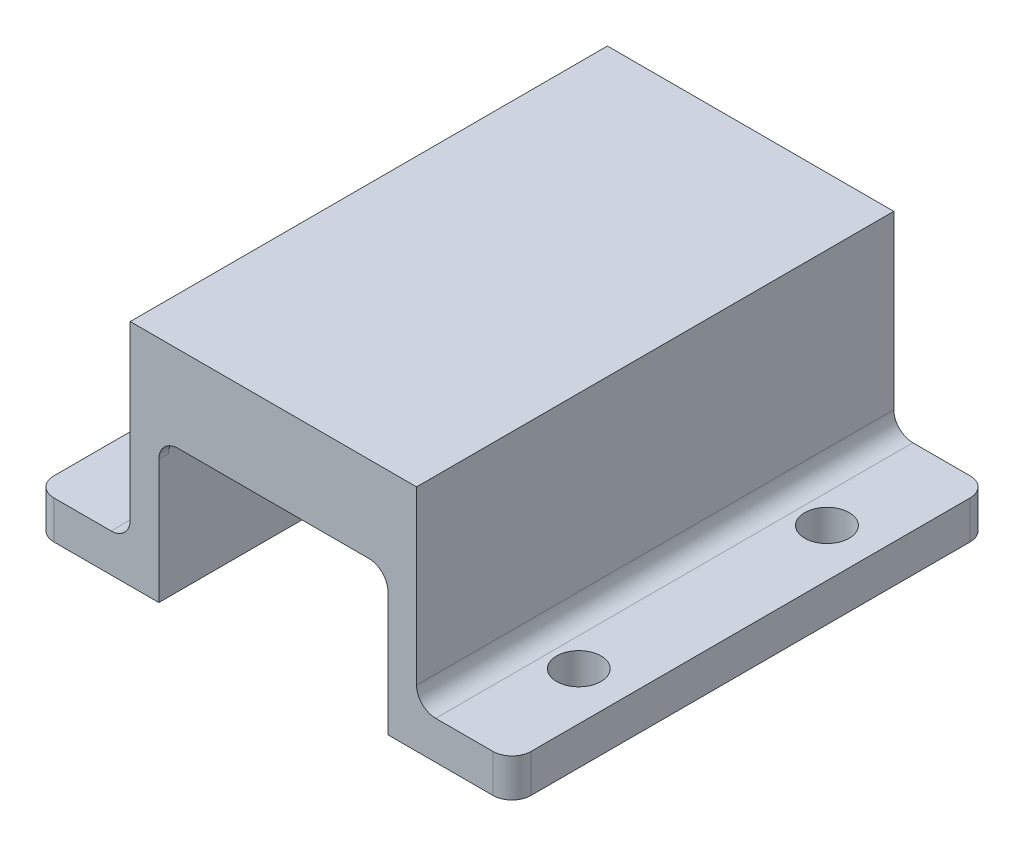
ISO-10303-21;
HEADER;
FILE_DESCRIPTION(('STEP AP214'),'2;1');
FILE_NAME('part.step','',(''),(''),'','','');
FILE_SCHEMA(('AUTOMOTIVE_DESIGN { 1 0 10303 214 1 1 1 1 }'));
ENDSEC;
DATA;
#1=APPLICATION_CONTEXT('core data for automotive mechanical design processes');
#2=APPLICATION_PROTOCOL_DEFINITION('international standard','automotive_design',2000,#1);
#3=PRODUCT_CONTEXT('',#1,'mechanical');
#4=PRODUCT('Part','Part','',(#3));
#5=PRODUCT_RELATED_PRODUCT_CATEGORY('part','',(#4));
#6=PRODUCT_DEFINITION_FORMATION('','',#4);
#7=PRODUCT_DEFINITION_CONTEXT('part definition',#1,'design');
#8=PRODUCT_DEFINITION('design','',#6,#7);
#9=PRODUCT_DEFINITION_SHAPE('','',#8);
#10=(LENGTH_UNIT() NAMED_UNIT(*) SI_UNIT(.MILLI.,.METRE.));
#11=(NAMED_UNIT(*) PLANE_ANGLE_UNIT() SI_UNIT($,.RADIAN.));
#12=(NAMED_UNIT(*) SI_UNIT($,.STERADIAN.) SOLID_ANGLE_UNIT());
#13=UNCERTAINTY_MEASURE_WITH_UNIT(LENGTH_MEASURE(1.E-05),#10,'distance_accuracy_value','');
#14=(GEOMETRIC_REPRESENTATION_CONTEXT(3) GLOBAL_UNCERTAINTY_ASSIGNED_CONTEXT((#13)) GLOBAL_UNIT_ASSIGNED_CONTEXT((#10,
#11,#12)) REPRESENTATION_CONTEXT('',''));
#15=CARTESIAN_POINT('',(0.,0.,0.));
#16=DIRECTION('',(0.,0.,1.));
#17=DIRECTION('',(1.,0.,0.));
#18=AXIS2_PLACEMENT_3D('',#15,#16,#17);
#19=CARTESIAN_POINT('',(1.5,0.,0.));
#20=DIRECTION('',(1.,0.,0.));
#21=DIRECTION('',(0.,0.,-1.));
#22=AXIS2_PLACEMENT_3D('',#19,#20,#21);
#23=PLANE('',#22);
#24=DIRECTION('',(0.,1.,0.));
#25=VECTOR('',#24,1.);
#26=CARTESIAN_POINT('',(1.5,7.5,29.5));
#27=LINE('',#26,#25);
#28=CARTESIAN_POINT('',(1.5,6.5,29.5));
#29=VERTEX_POINT('',#28);
#30=CARTESIAN_POINT('',(1.5,9.,29.5));
#31=VERTEX_POINT('',#30);
#32=EDGE_CURVE('E455',#29,#31,#27,.T.);
#33=ORIENTED_EDGE('',*,*,#32,.F.);
#34=DIRECTION('',(0.,0.,-1.));
#35=VECTOR('',#34,1.);
#36=CARTESIAN_POINT('',(1.5,6.5,0.));
#37=LINE('',#36,#35);
#38=CARTESIAN_POINT('',(1.5,6.5,30.));
#39=VERTEX_POINT('',#38);
#40=EDGE_CURVE('E294',#29,#39,#37,.F.);
#41=ORIENTED_EDGE('',*,*,#40,.T.);
#42=DIRECTION('',(0.,1.,0.));
#43=VECTOR('',#42,1.);
#44=CARTESIAN_POINT('',(1.5,0.,30.));
#45=LINE('',#44,#43);
#46=CARTESIAN_POINT('',(1.5,0.,30.));
#47=VERTEX_POINT('',#46);
#48=EDGE_CURVE('E447',#47,#39,#45,.T.);
#49=ORIENTED_EDGE('',*,*,#48,.F.);
#50=DIRECTION('',(0.,0.,1.));
#51=VECTOR('',#50,1.);
#52=CARTESIAN_POINT('',(1.5,0.,0.));
#53=LINE('',#52,#51);
#54=CARTESIAN_POINT('',(1.5,0.,4.99999999999999));
#55=VERTEX_POINT('',#54);
#56=EDGE_CURVE('E439',#55,#47,#53,.T.);
#57=ORIENTED_EDGE('',*,*,#56,.F.);
#58=DIRECTION('',(0.,-1.,0.));
#59=VECTOR('',#58,1.);
#60=CARTESIAN_POINT('',(1.5,0.,4.99999999999999));
#61=LINE('',#60,#59);
#62=CARTESIAN_POINT('',(1.5,6.5,4.99999999999999));
#63=VERTEX_POINT('',#62);
#64=EDGE_CURVE('E504',#63,#55,#61,.T.);
#65=ORIENTED_EDGE('',*,*,#64,.F.);
#66=DIRECTION('',(0.,0.,-1.));
#67=VECTOR('',#66,1.);
#68=CARTESIAN_POINT('',(1.5,6.5,0.));
#69=LINE('',#68,#67);
#70=CARTESIAN_POINT('',(1.5,6.5,5.5));
#71=VERTEX_POINT('',#70);
#72=EDGE_CURVE('E290',#63,#71,#69,.F.);
#73=ORIENTED_EDGE('',*,*,#72,.T.);
#74=DIRECTION('',(0.,1.,0.));
#75=VECTOR('',#74,1.);
#76=CARTESIAN_POINT('',(1.5,7.5,5.5));
#77=LINE('',#76,#75);
#78=CARTESIAN_POINT('',(1.5,9.,5.5));
#79=VERTEX_POINT('',#78);
#80=EDGE_CURVE('E482',#71,#79,#77,.T.);
#81=ORIENTED_EDGE('',*,*,#80,.T.);
#82=DIRECTION('',(0.,0.,1.));
#83=VECTOR('',#82,1.);
#84=CARTESIAN_POINT('',(1.5,9.,30.));
#85=LINE('',#84,#83);
#86=EDGE_CURVE('E271',#79,#31,#85,.T.);
#87=ORIENTED_EDGE('',*,*,#86,.T.);
#88=EDGE_LOOP('',(#33,#41,#49,#57,#65,#73,#81,#87));
#89=FACE_BOUND('',#88,.T.);
#90=ADVANCED_FACE('F39',(#89),#23,.T.);
#91=CARTESIAN_POINT('',(1.5,10.,0.));
#92=DIRECTION('',(0.,-1.,0.));
#93=DIRECTION('',(0.,0.,-1.));
#94=AXIS2_PLACEMENT_3D('',#91,#92,#93);
#95=PLANE('',#94);
#96=DIRECTION('',(0.,0.,1.));
#97=VECTOR('',#96,1.);
#98=CARTESIAN_POINT('',(2.5,10.,0.));
#99=LINE('',#98,#97);
#100=CARTESIAN_POINT('',(2.5,10.,29.5));
#101=VERTEX_POINT('',#100);
#102=CARTESIAN_POINT('',(2.5,10.,5.5));
#103=VERTEX_POINT('',#102);
#104=EDGE_CURVE('E254',#101,#103,#99,.F.);
#105=ORIENTED_EDGE('',*,*,#104,.T.);
#106=DIRECTION('',(-1.,0.,0.));
#107=VECTOR('',#106,1.);
#108=CARTESIAN_POINT('',(13.5,10.,5.5));
#109=LINE('',#108,#107);
#110=CARTESIAN_POINT('',(12.5,10.,5.5));
#111=VERTEX_POINT('',#110);
#112=EDGE_CURVE('E486',#111,#103,#109,.T.);
#113=ORIENTED_EDGE('',*,*,#112,.F.);
#114=DIRECTION('',(0.,0.,1.));
#115=VECTOR('',#114,1.);
#116=CARTESIAN_POINT('',(12.5,10.,0.));
#117=LINE('',#116,#115);
#118=CARTESIAN_POINT('',(12.5,10.,29.5));
#119=VERTEX_POINT('',#118);
#120=EDGE_CURVE('E260',#111,#119,#117,.T.);
#121=ORIENTED_EDGE('',*,*,#120,.T.);
#122=DIRECTION('',(1.,0.,0.));
#123=VECTOR('',#122,1.);
#124=CARTESIAN_POINT('',(13.5,10.,29.5));
#125=LINE('',#124,#123);
#126=EDGE_CURVE('E463',#101,#119,#125,.T.);
#127=ORIENTED_EDGE('',*,*,#126,.F.);
#128=EDGE_LOOP('',(#105,#113,#121,#127));
#129=FACE_BOUND('',#128,.T.);
#130=ADVANCED_FACE('F598',(#129),#95,.T.);
#131=CARTESIAN_POINT('',(13.5,0.,0.));
#132=DIRECTION('',(1.,0.,0.));
#133=DIRECTION('',(0.,0.,-1.));
#134=AXIS2_PLACEMENT_3D('',#131,#132,#133);
#135=PLANE('',#134);
#136=DIRECTION('',(0.,1.,0.));
#137=VECTOR('',#136,1.);
#138=CARTESIAN_POINT('',(13.5,0.,30.));
#139=LINE('',#138,#137);
#140=CARTESIAN_POINT('',(13.5,0.,30.));
#141=VERTEX_POINT('',#140);
#142=CARTESIAN_POINT('',(13.5,6.5,30.));
#143=VERTEX_POINT('',#142);
#144=EDGE_CURVE('E443',#141,#143,#139,.T.);
#145=ORIENTED_EDGE('',*,*,#144,.T.);
#146=DIRECTION('',(0.,0.,1.));
#147=VECTOR('',#146,1.);
#148=CARTESIAN_POINT('',(13.5,6.5,29.5));
#149=LINE('',#148,#147);
#150=CARTESIAN_POINT('',(13.5,6.5,29.5));
#151=VERTEX_POINT('',#150);
#152=EDGE_CURVE('E300',#143,#151,#149,.F.);
#153=ORIENTED_EDGE('',*,*,#152,.T.);
#154=DIRECTION('',(0.,1.,0.));
#155=VECTOR('',#154,1.);
#156=CARTESIAN_POINT('',(13.5,7.5,29.5));
#157=LINE('',#156,#155);
#158=CARTESIAN_POINT('',(13.5,9.,29.5));
#159=VERTEX_POINT('',#158);
#160=EDGE_CURVE('E459',#151,#159,#157,.T.);
#161=ORIENTED_EDGE('',*,*,#160,.T.);
#162=DIRECTION('',(0.,0.,1.));
#163=VECTOR('',#162,1.);
#164=CARTESIAN_POINT('',(13.5,9.,0.));
#165=LINE('',#164,#163);
#166=CARTESIAN_POINT('',(13.5,9.,5.5));
#167=VERTEX_POINT('',#166);
#168=EDGE_CURVE('E267',#159,#167,#165,.F.);
#169=ORIENTED_EDGE('',*,*,#168,.T.);
#170=DIRECTION('',(0.,1.,0.));
#171=VECTOR('',#170,1.);
#172=CARTESIAN_POINT('',(13.5,7.5,5.5));
#173=LINE('',#172,#171);
#174=CARTESIAN_POINT('',(13.5,6.5,5.5));
#175=VERTEX_POINT('',#174);
#176=EDGE_CURVE('E478',#175,#167,#173,.T.);
#177=ORIENTED_EDGE('',*,*,#176,.F.);
#178=DIRECTION('',(0.,0.,1.));
#179=VECTOR('',#178,1.);
#180=CARTESIAN_POINT('',(13.5,6.5,5.));
#181=LINE('',#180,#179);
#182=CARTESIAN_POINT('',(13.5,6.5,5.));
#183=VERTEX_POINT('',#182);
#184=EDGE_CURVE('E297',#175,#183,#181,.F.);
#185=ORIENTED_EDGE('',*,*,#184,.T.);
#186=DIRECTION('',(0.,-1.,0.));
#187=VECTOR('',#186,1.);
#188=CARTESIAN_POINT('',(13.5,0.,5.));
#189=LINE('',#188,#187);
#190=CARTESIAN_POINT('',(13.5,0.,5.));
#191=VERTEX_POINT('',#190);
#192=EDGE_CURVE('E508',#183,#191,#189,.T.);
#193=ORIENTED_EDGE('',*,*,#192,.T.);
#194=DIRECTION('',(0.,0.,1.));
#195=VECTOR('',#194,1.);
#196=CARTESIAN_POINT('',(13.5,0.,0.));
#197=LINE('',#196,#195);
#198=EDGE_CURVE('E436',#191,#141,#197,.T.);
#199=ORIENTED_EDGE('',*,*,#198,.T.);
#200=EDGE_LOOP('',(#145,#153,#161,#169,#177,#185,#193,#199));
#201=FACE_BOUND('',#200,.T.);
#202=ADVANCED_FACE('F606',(#201),#135,.F.);
#203=CARTESIAN_POINT('',(12.5,9.,0.));
#204=DIRECTION('',(0.,0.,1.));
#205=DIRECTION('',(1.,0.,0.));
#206=AXIS2_PLACEMENT_3D('',#203,#204,#205);
#207=CYLINDRICAL_SURFACE('',#206,1.);
#208=CARTESIAN_POINT('',(12.5,9.,5.5));
#209=DIRECTION('',(0.,0.,-1.));
#210=DIRECTION('',(-1.,0.,0.));
#211=AXIS2_PLACEMENT_3D('',#208,#209,#210);
#212=CIRCLE('',#211,1.);
#213=EDGE_CURVE('E468',#167,#111,#212,.F.);
#214=ORIENTED_EDGE('',*,*,#213,.F.);
#215=ORIENTED_EDGE('',*,*,#168,.F.);
#216=CARTESIAN_POINT('',(12.5,9.,29.5));
#217=DIRECTION('',(0.,0.,1.));
#218=DIRECTION('',(1.,0.,0.));
#219=AXIS2_PLACEMENT_3D('',#216,#217,#218);
#220=CIRCLE('',#219,1.);
#221=EDGE_CURVE('E451',#119,#159,#220,.F.);
#222=ORIENTED_EDGE('',*,*,#221,.F.);
#223=ORIENTED_EDGE('',*,*,#120,.F.);
#224=EDGE_LOOP('',(#214,#215,#222,#223));
#225=FACE_BOUND('',#224,.T.);
#226=ADVANCED_FACE('F624',(#225),#207,.F.);
#227=CARTESIAN_POINT('',(2.5,9.,0.));
#228=DIRECTION('',(0.,0.,-1.));
#229=DIRECTION('',(-1.,0.,0.));
#230=AXIS2_PLACEMENT_3D('',#227,#228,#229);
#231=CYLINDRICAL_SURFACE('',#230,1.);
#232=CARTESIAN_POINT('',(2.5,9.,5.5));
#233=DIRECTION('',(0.,0.,-1.));
#234=DIRECTION('',(-1.,0.,0.));
#235=AXIS2_PLACEMENT_3D('',#232,#233,#234);
#236=CIRCLE('',#235,1.);
#237=EDGE_CURVE('E278',#103,#79,#236,.F.);
#238=ORIENTED_EDGE('',*,*,#237,.F.);
#239=ORIENTED_EDGE('',*,*,#104,.F.);
#240=CARTESIAN_POINT('',(2.5,9.,29.5));
#241=DIRECTION('',(0.,0.,1.));
#242=DIRECTION('',(1.,0.,0.));
#243=AXIS2_PLACEMENT_3D('',#240,#241,#242);
#244=CIRCLE('',#243,1.);
#245=EDGE_CURVE('E274',#31,#101,#244,.F.);
#246=ORIENTED_EDGE('',*,*,#245,.F.);
#247=ORIENTED_EDGE('',*,*,#86,.F.);
#248=EDGE_LOOP('',(#238,#239,#246,#247));
#249=FACE_BOUND('',#248,.T.);
#250=ADVANCED_FACE('F582',(#249),#231,.F.);
#251=CARTESIAN_POINT('',(0.,0.,30.));
#252=DIRECTION('',(0.,1.,0.));
#253=DIRECTION('',(0.,0.,1.));
#254=AXIS2_PLACEMENT_3D('',#251,#252,#253);
#255=PLANE('',#254);
#256=DIRECTION('',(1.,0.,0.));
#257=VECTOR('',#256,1.);
#258=CARTESIAN_POINT('',(0.,0.,30.));
#259=LINE('',#258,#257);
#260=CARTESIAN_POINT('',(-4.,0.,30.));
#261=VERTEX_POINT('',#260);
#262=EDGE_CURVE('E425',#261,#47,#259,.T.);
#263=ORIENTED_EDGE('',*,*,#262,.F.);
#264=CARTESIAN_POINT('',(-4.,0.,29.));
#265=DIRECTION('',(0.,1.,0.));
#266=DIRECTION('',(0.,0.,1.));
#267=AXIS2_PLACEMENT_3D('',#264,#265,#266);
#268=CIRCLE('',#267,1.);
#269=CARTESIAN_POINT('',(-5.,0.,29.));
#270=VERTEX_POINT('',#269);
#271=EDGE_CURVE('E322',#261,#270,#268,.F.);
#272=ORIENTED_EDGE('',*,*,#271,.T.);
#273=DIRECTION('',(0.,0.,-1.));
#274=VECTOR('',#273,1.);
#275=CARTESIAN_POINT('',(-5.,0.,5.));
#276=LINE('',#275,#274);
#277=CARTESIAN_POINT('',(-5.,0.,5.99999999999999));
#278=VERTEX_POINT('',#277);
#279=EDGE_CURVE('E537',#270,#278,#276,.T.);
#280=ORIENTED_EDGE('',*,*,#279,.T.);
#281=CARTESIAN_POINT('',(-4.,0.,5.99999999999999));
#282=DIRECTION('',(0.,1.,0.));
#283=DIRECTION('',(0.,0.,1.));
#284=AXIS2_PLACEMENT_3D('',#281,#282,#283);
#285=CIRCLE('',#284,1.);
#286=CARTESIAN_POINT('',(-4.,0.,4.99999999999999));
#287=VERTEX_POINT('',#286);
#288=EDGE_CURVE('E319',#278,#287,#285,.F.);
#289=ORIENTED_EDGE('',*,*,#288,.T.);
#290=DIRECTION('',(1.,0.,0.));
#291=VECTOR('',#290,1.);
#292=CARTESIAN_POINT('',(0.,0.,4.99999999999999));
#293=LINE('',#292,#291);
#294=EDGE_CURVE('E491',#287,#55,#293,.T.);
#295=ORIENTED_EDGE('',*,*,#294,.T.);
#296=ORIENTED_EDGE('',*,*,#56,.T.);
#297=EDGE_LOOP('',(#263,#272,#280,#289,#295,#296));
#298=FACE_BOUND('',#297,.T.);
#299=CARTESIAN_POINT('',(-2.5,0.,24.));
#300=DIRECTION('',(0.,-1.,0.));
#301=DIRECTION('',(0.,0.,1.));
#302=AXIS2_PLACEMENT_3D('',#299,#300,#301);
#303=CIRCLE('',#302,1.16297504238046);
#304=CARTESIAN_POINT('',(-2.5,0.,25.1629750423805));
#305=VERTEX_POINT('',#304);
#306=EDGE_CURVE('E560',#305,#305,#303,.T.);
#307=ORIENTED_EDGE('',*,*,#306,.F.);
#308=EDGE_LOOP('',(#307));
#309=FACE_BOUND('',#308,.T.);
#310=CARTESIAN_POINT('',(-2.5,0.,11.));
#311=DIRECTION('',(0.,-1.,0.));
#312=DIRECTION('',(0.,0.,1.));
#313=AXIS2_PLACEMENT_3D('',#310,#311,#312);
#314=CIRCLE('',#313,1.16485131417154);
#315=CARTESIAN_POINT('',(-2.5,0.,12.1648513141715));
#316=VERTEX_POINT('',#315);
#317=EDGE_CURVE('E552',#316,#316,#314,.T.);
#318=ORIENTED_EDGE('',*,*,#317,.F.);
#319=EDGE_LOOP('',(#318));
#320=FACE_BOUND('',#319,.T.);
#321=ADVANCED_FACE('F579',(#298,#309,#320),#255,.F.);
#322=CARTESIAN_POINT('',(0.,0.,30.));
#323=DIRECTION('',(0.,0.,-1.));
#324=DIRECTION('',(-1.,0.,0.));
#325=AXIS2_PLACEMENT_3D('',#322,#323,#324);
#326=PLANE('',#325);
#327=DIRECTION('',(-1.,0.,0.));
#328=VECTOR('',#327,1.);
#329=CARTESIAN_POINT('',(0.,2.,30.));
#330=LINE('',#329,#328);
#331=CARTESIAN_POINT('',(-1.,2.,30.));
#332=VERTEX_POINT('',#331);
#333=CARTESIAN_POINT('',(-4.,2.,30.));
#334=VERTEX_POINT('',#333);
#335=EDGE_CURVE('E541',#332,#334,#330,.T.);
#336=ORIENTED_EDGE('',*,*,#335,.T.);
#337=DIRECTION('',(0.,-1.,0.));
#338=VECTOR('',#337,1.);
#339=CARTESIAN_POINT('',(-4.,0.,30.));
#340=LINE('',#339,#338);
#341=EDGE_CURVE('E315',#334,#261,#340,.T.);
#342=ORIENTED_EDGE('',*,*,#341,.T.);
#343=ORIENTED_EDGE('',*,*,#262,.T.);
#344=ORIENTED_EDGE('',*,*,#48,.T.);
#345=CARTESIAN_POINT('',(2.5,6.5,30.));
#346=DIRECTION('',(0.,0.,-1.));
#347=DIRECTION('',(-1.,0.,0.));
#348=AXIS2_PLACEMENT_3D('',#345,#346,#347);
#349=CIRCLE('',#348,1.);
#350=CARTESIAN_POINT('',(2.5,7.5,30.));
#351=VERTEX_POINT('',#350);
#352=EDGE_CURVE('E378',#39,#351,#349,.T.);
#353=ORIENTED_EDGE('',*,*,#352,.T.);
#354=DIRECTION('',(-1.,0.,0.));
#355=VECTOR('',#354,1.);
#356=CARTESIAN_POINT('',(13.5,7.5,30.));
#357=LINE('',#356,#355);
#358=CARTESIAN_POINT('',(12.5,7.5,30.));
#359=VERTEX_POINT('',#358);
#360=EDGE_CURVE('E467',#359,#351,#357,.T.);
#361=ORIENTED_EDGE('',*,*,#360,.F.);
#362=CARTESIAN_POINT('',(12.5,6.5,30.));
#363=DIRECTION('',(0.,0.,-1.));
#364=DIRECTION('',(-1.,0.,0.));
#365=AXIS2_PLACEMENT_3D('',#362,#363,#364);
#366=CIRCLE('',#365,1.);
#367=EDGE_CURVE('E381',#359,#143,#366,.T.);
#368=ORIENTED_EDGE('',*,*,#367,.T.);
#369=ORIENTED_EDGE('',*,*,#144,.F.);
#370=CARTESIAN_POINT('',(19.,0.,30.));
#371=VERTEX_POINT('',#370);
#372=EDGE_CURVE('E429',#141,#371,#259,.T.);
#373=ORIENTED_EDGE('',*,*,#372,.T.);
#374=DIRECTION('',(0.,-1.,0.));
#375=VECTOR('',#374,1.);
#376=CARTESIAN_POINT('',(19.,2.,30.));
#377=LINE('',#376,#375);
#378=CARTESIAN_POINT('',(19.,2.,30.));
#379=VERTEX_POINT('',#378);
#380=EDGE_CURVE('E312',#371,#379,#377,.F.);
#381=ORIENTED_EDGE('',*,*,#380,.T.);
#382=DIRECTION('',(-1.,0.,0.));
#383=VECTOR('',#382,1.);
#384=CARTESIAN_POINT('',(15.,2.,30.));
#385=LINE('',#384,#383);
#386=CARTESIAN_POINT('',(16.,2.,30.));
#387=VERTEX_POINT('',#386);
#388=EDGE_CURVE('E238',#379,#387,#385,.T.);
#389=ORIENTED_EDGE('',*,*,#388,.T.);
#390=CARTESIAN_POINT('',(16.,3.,30.));
#391=DIRECTION('',(0.,0.,-1.));
#392=DIRECTION('',(-1.,0.,0.));
#393=AXIS2_PLACEMENT_3D('',#390,#391,#392);
#394=CIRCLE('',#393,1.);
#395=CARTESIAN_POINT('',(15.,3.,30.));
#396=VERTEX_POINT('',#395);
#397=EDGE_CURVE('E11',#387,#396,#394,.T.);
#398=ORIENTED_EDGE('',*,*,#397,.T.);
#399=DIRECTION('',(0.,1.,0.));
#400=VECTOR('',#399,1.);
#401=CARTESIAN_POINT('',(15.,0.,30.));
#402=LINE('',#401,#400);
#403=CARTESIAN_POINT('',(15.,12.,30.));
#404=VERTEX_POINT('',#403);
#405=EDGE_CURVE('E423',#396,#404,#402,.T.);
#406=ORIENTED_EDGE('',*,*,#405,.T.);
#407=DIRECTION('',(-1.,0.,0.));
#408=VECTOR('',#407,1.);
#409=CARTESIAN_POINT('',(0.,12.,30.));
#410=LINE('',#409,#408);
#411=CARTESIAN_POINT('',(0.,12.,30.));
#412=VERTEX_POINT('',#411);
#413=EDGE_CURVE('E252',#404,#412,#410,.T.);
#414=ORIENTED_EDGE('',*,*,#413,.T.);
#415=DIRECTION('',(0.,-1.,0.));
#416=VECTOR('',#415,1.);
#417=CARTESIAN_POINT('',(0.,0.,30.));
#418=LINE('',#417,#416);
#419=CARTESIAN_POINT('',(0.,3.,30.));
#420=VERTEX_POINT('',#419);
#421=EDGE_CURVE('E432',#412,#420,#418,.T.);
#422=ORIENTED_EDGE('',*,*,#421,.T.);
#423=CARTESIAN_POINT('',(-1.,3.,30.));
#424=DIRECTION('',(0.,0.,-1.));
#425=DIRECTION('',(-1.,0.,0.));
#426=AXIS2_PLACEMENT_3D('',#423,#424,#425);
#427=CIRCLE('',#426,1.);
#428=EDGE_CURVE('E400',#420,#332,#427,.T.);
#429=ORIENTED_EDGE('',*,*,#428,.T.);
#430=EDGE_LOOP('',(#336,#342,#343,#344,#353,#361,#368,#369,#373,#381,#389,#398,#406,#414,#422,#429));
#431=FACE_BOUND('',#430,.T.);
#432=ADVANCED_FACE('F422',(#431),#326,.F.);
#433=CARTESIAN_POINT('',(0.,0.,30.));
#434=DIRECTION('',(1.,0.,0.));
#435=DIRECTION('',(0.,0.,-1.));
#436=AXIS2_PLACEMENT_3D('',#433,#434,#435);
#437=PLANE('',#436);
#438=DIRECTION('',(0.,-1.,0.));
#439=VECTOR('',#438,1.);
#440=CARTESIAN_POINT('',(0.,12.,4.99999999999999));
#441=LINE('',#440,#439);
#442=CARTESIAN_POINT('',(0.,12.,5.));
#443=VERTEX_POINT('',#442);
#444=CARTESIAN_POINT('',(0.,3.,4.99999999999999));
#445=VERTEX_POINT('',#444);
#446=EDGE_CURVE('E232',#443,#445,#441,.T.);
#447=ORIENTED_EDGE('',*,*,#446,.T.);
#448=DIRECTION('',(0.,0.,1.));
#449=VECTOR('',#448,1.);
#450=CARTESIAN_POINT('',(0.,3.,30.));
#451=LINE('',#450,#449);
#452=EDGE_CURVE('E348',#445,#420,#451,.T.);
#453=ORIENTED_EDGE('',*,*,#452,.T.);
#454=ORIENTED_EDGE('',*,*,#421,.F.);
#455=DIRECTION('',(0.,0.,-1.));
#456=VECTOR('',#455,1.);
#457=CARTESIAN_POINT('',(0.,12.,30.));
#458=LINE('',#457,#456);
#459=EDGE_CURVE('E255',#412,#443,#458,.T.);
#460=ORIENTED_EDGE('',*,*,#459,.T.);
#461=EDGE_LOOP('',(#447,#453,#454,#460));
#462=FACE_BOUND('',#461,.T.);
#463=ADVANCED_FACE('F613',(#462),#437,.F.);
#464=DIRECTION('',(1.,0.,0.));
#465=VECTOR('',#464,1.);
#466=CARTESIAN_POINT('',(0.,0.,4.99999999999999));
#467=LINE('',#466,#465);
#468=CARTESIAN_POINT('',(19.,0.,5.));
#469=VERTEX_POINT('',#468);
#470=EDGE_CURVE('E500',#191,#469,#467,.T.);
#471=ORIENTED_EDGE('',*,*,#470,.T.);
#472=CARTESIAN_POINT('',(19.,0.,6.));
#473=DIRECTION('',(0.,1.,0.));
#474=DIRECTION('',(0.,0.,1.));
#475=AXIS2_PLACEMENT_3D('',#472,#473,#474);
#476=CIRCLE('',#475,1.);
#477=CARTESIAN_POINT('',(20.,0.,6.));
#478=VERTEX_POINT('',#477);
#479=EDGE_CURVE('E355',#469,#478,#476,.F.);
#480=ORIENTED_EDGE('',*,*,#479,.T.);
#481=DIRECTION('',(0.,0.,1.));
#482=VECTOR('',#481,1.);
#483=CARTESIAN_POINT('',(20.,0.,5.));
#484=LINE('',#483,#482);
#485=CARTESIAN_POINT('',(20.,0.,29.));
#486=VERTEX_POINT('',#485);
#487=EDGE_CURVE('E417',#478,#486,#484,.T.);
#488=ORIENTED_EDGE('',*,*,#487,.T.);
#489=CARTESIAN_POINT('',(19.,0.,29.));
#490=DIRECTION('',(0.,1.,0.));
#491=DIRECTION('',(0.,0.,1.));
#492=AXIS2_PLACEMENT_3D('',#489,#490,#491);
#493=CIRCLE('',#492,1.);
#494=EDGE_CURVE('E352',#486,#371,#493,.F.);
#495=ORIENTED_EDGE('',*,*,#494,.T.);
#496=ORIENTED_EDGE('',*,*,#372,.F.);
#497=ORIENTED_EDGE('',*,*,#198,.F.);
#498=EDGE_LOOP('',(#471,#480,#488,#495,#496,#497));
#499=FACE_BOUND('',#498,.T.);
#500=CARTESIAN_POINT('',(17.5,0.,11.));
#501=DIRECTION('',(0.,-1.,0.));
#502=DIRECTION('',(0.,0.,-1.));
#503=AXIS2_PLACEMENT_3D('',#500,#501,#502);
#504=CIRCLE('',#503,1.16485131417154);
#505=CARTESIAN_POINT('',(17.5,0.,9.83514868582846));
#506=VERTEX_POINT('',#505);
#507=EDGE_CURVE('E529',#506,#506,#504,.T.);
#508=ORIENTED_EDGE('',*,*,#507,.F.);
#509=EDGE_LOOP('',(#508));
#510=FACE_BOUND('',#509,.T.);
#511=CARTESIAN_POINT('',(17.5,0.,24.));
#512=DIRECTION('',(0.,-1.,0.));
#513=DIRECTION('',(0.,0.,-1.));
#514=AXIS2_PLACEMENT_3D('',#511,#512,#513);
#515=CIRCLE('',#514,1.16297504238046);
#516=CARTESIAN_POINT('',(17.5,0.,22.8370249576195));
#517=VERTEX_POINT('',#516);
#518=EDGE_CURVE('E521',#517,#517,#515,.T.);
#519=ORIENTED_EDGE('',*,*,#518,.F.);
#520=EDGE_LOOP('',(#519));
#521=FACE_BOUND('',#520,.T.);
#522=ADVANCED_FACE('F585',(#499,#510,#521),#255,.F.);
#523=CARTESIAN_POINT('',(15.,0.,30.));
#524=DIRECTION('',(-1.,0.,0.));
#525=DIRECTION('',(0.,0.,1.));
#526=AXIS2_PLACEMENT_3D('',#523,#524,#525);
#527=PLANE('',#526);
#528=ORIENTED_EDGE('',*,*,#405,.F.);
#529=DIRECTION('',(0.,0.,-1.));
#530=VECTOR('',#529,1.);
#531=CARTESIAN_POINT('',(15.,3.,30.));
#532=LINE('',#531,#530);
#533=CARTESIAN_POINT('',(15.,3.,5.));
#534=VERTEX_POINT('',#533);
#535=EDGE_CURVE('E248',#396,#534,#532,.T.);
#536=ORIENTED_EDGE('',*,*,#535,.T.);
#537=DIRECTION('',(0.,-1.,0.));
#538=VECTOR('',#537,1.);
#539=CARTESIAN_POINT('',(15.,12.,5.));
#540=LINE('',#539,#538);
#541=CARTESIAN_POINT('',(15.,12.,5.));
#542=VERTEX_POINT('',#541);
#543=EDGE_CURVE('E230',#542,#534,#540,.T.);
#544=ORIENTED_EDGE('',*,*,#543,.F.);
#545=DIRECTION('',(0.,0.,-1.));
#546=VECTOR('',#545,1.);
#547=CARTESIAN_POINT('',(15.,12.,30.));
#548=LINE('',#547,#546);
#549=EDGE_CURVE('E245',#404,#542,#548,.T.);
#550=ORIENTED_EDGE('',*,*,#549,.F.);
#551=EDGE_LOOP('',(#528,#536,#544,#550));
#552=FACE_BOUND('',#551,.T.);
#553=ADVANCED_FACE('F244',(#552),#527,.F.);
#554=CARTESIAN_POINT('',(0.,12.,30.));
#555=DIRECTION('',(0.,-1.,0.));
#556=DIRECTION('',(0.,0.,-1.));
#557=AXIS2_PLACEMENT_3D('',#554,#555,#556);
#558=PLANE('',#557);
#559=ORIENTED_EDGE('',*,*,#549,.T.);
#560=DIRECTION('',(-1.,0.,0.));
#561=VECTOR('',#560,1.);
#562=CARTESIAN_POINT('',(15.,12.,5.));
#563=LINE('',#562,#561);
#564=EDGE_CURVE('E226',#542,#443,#563,.T.);
#565=ORIENTED_EDGE('',*,*,#564,.T.);
#566=ORIENTED_EDGE('',*,*,#459,.F.);
#567=ORIENTED_EDGE('',*,*,#413,.F.);
#568=EDGE_LOOP('',(#559,#565,#566,#567));
#569=FACE_BOUND('',#568,.T.);
#570=ADVANCED_FACE('F251',(#569),#558,.F.);
#571=CARTESIAN_POINT('',(13.5,7.5,29.5));
#572=DIRECTION('',(0.,0.,1.));
#573=DIRECTION('',(1.,0.,0.));
#574=AXIS2_PLACEMENT_3D('',#571,#572,#573);
#575=PLANE('',#574);
#576=ORIENTED_EDGE('',*,*,#126,.T.);
#577=ORIENTED_EDGE('',*,*,#221,.T.);
#578=ORIENTED_EDGE('',*,*,#160,.F.);
#579=CARTESIAN_POINT('',(12.5,6.5,29.5));
#580=DIRECTION('',(0.,0.,1.));
#581=DIRECTION('',(1.,0.,0.));
#582=AXIS2_PLACEMENT_3D('',#579,#580,#581);
#583=CIRCLE('',#582,1.);
#584=CARTESIAN_POINT('',(12.5,7.5,29.5));
#585=VERTEX_POINT('',#584);
#586=EDGE_CURVE('E384',#151,#585,#583,.T.);
#587=ORIENTED_EDGE('',*,*,#586,.T.);
#588=DIRECTION('',(1.,0.,0.));
#589=VECTOR('',#588,1.);
#590=CARTESIAN_POINT('',(13.5,7.5,29.5));
#591=LINE('',#590,#589);
#592=CARTESIAN_POINT('',(2.5,7.5,29.5));
#593=VERTEX_POINT('',#592);
#594=EDGE_CURVE('E462',#593,#585,#591,.T.);
#595=ORIENTED_EDGE('',*,*,#594,.F.);
#596=CARTESIAN_POINT('',(2.5,6.5,29.5));
#597=DIRECTION('',(0.,0.,1.));
#598=DIRECTION('',(1.,0.,0.));
#599=AXIS2_PLACEMENT_3D('',#596,#597,#598);
#600=CIRCLE('',#599,1.);
#601=EDGE_CURVE('E374',#593,#29,#600,.T.);
#602=ORIENTED_EDGE('',*,*,#601,.T.);
#603=ORIENTED_EDGE('',*,*,#32,.T.);
#604=ORIENTED_EDGE('',*,*,#245,.T.);
#605=EDGE_LOOP('',(#576,#577,#578,#587,#595,#602,#603,#604));
#606=FACE_BOUND('',#605,.T.);
#607=ADVANCED_FACE('F616',(#606),#575,.F.);
#608=CARTESIAN_POINT('',(0.,7.5,0.));
#609=DIRECTION('',(0.,1.,0.));
#610=DIRECTION('',(0.,0.,1.));
#611=AXIS2_PLACEMENT_3D('',#608,#609,#610);
#612=PLANE('',#611);
#613=ORIENTED_EDGE('',*,*,#360,.T.);
#614=DIRECTION('',(0.,0.,-1.));
#615=VECTOR('',#614,1.);
#616=CARTESIAN_POINT('',(2.5,7.5,0.));
#617=LINE('',#616,#615);
#618=EDGE_CURVE('E286',#351,#593,#617,.T.);
#619=ORIENTED_EDGE('',*,*,#618,.T.);
#620=ORIENTED_EDGE('',*,*,#594,.T.);
#621=DIRECTION('',(0.,0.,1.));
#622=VECTOR('',#621,1.);
#623=CARTESIAN_POINT('',(12.5,7.5,30.));
#624=LINE('',#623,#622);
#625=EDGE_CURVE('E282',#585,#359,#624,.T.);
#626=ORIENTED_EDGE('',*,*,#625,.T.);
#627=EDGE_LOOP('',(#613,#619,#620,#626));
#628=FACE_BOUND('',#627,.T.);
#629=ADVANCED_FACE('F684',(#628),#612,.F.);
#630=CARTESIAN_POINT('',(13.5,7.5,5.5));
#631=DIRECTION('',(0.,0.,-1.));
#632=DIRECTION('',(-1.,0.,0.));
#633=AXIS2_PLACEMENT_3D('',#630,#631,#632);
#634=PLANE('',#633);
#635=ORIENTED_EDGE('',*,*,#176,.T.);
#636=ORIENTED_EDGE('',*,*,#213,.T.);
#637=ORIENTED_EDGE('',*,*,#112,.T.);
#638=ORIENTED_EDGE('',*,*,#237,.T.);
#639=ORIENTED_EDGE('',*,*,#80,.F.);
#640=CARTESIAN_POINT('',(2.5,6.5,5.5));
#641=DIRECTION('',(0.,0.,-1.));
#642=DIRECTION('',(-1.,0.,0.));
#643=AXIS2_PLACEMENT_3D('',#640,#641,#642);
#644=CIRCLE('',#643,1.);
#645=CARTESIAN_POINT('',(2.5,7.5,5.5));
#646=VERTEX_POINT('',#645);
#647=EDGE_CURVE('E397',#71,#646,#644,.T.);
#648=ORIENTED_EDGE('',*,*,#647,.T.);
#649=DIRECTION('',(-1.,0.,0.));
#650=VECTOR('',#649,1.);
#651=CARTESIAN_POINT('',(13.5,7.5,5.5));
#652=LINE('',#651,#650);
#653=CARTESIAN_POINT('',(12.5,7.5,5.5));
#654=VERTEX_POINT('',#653);
#655=EDGE_CURVE('E490',#654,#646,#652,.T.);
#656=ORIENTED_EDGE('',*,*,#655,.F.);
#657=CARTESIAN_POINT('',(12.5,6.5,5.5));
#658=DIRECTION('',(0.,0.,-1.));
#659=DIRECTION('',(-1.,0.,0.));
#660=AXIS2_PLACEMENT_3D('',#657,#658,#659);
#661=CIRCLE('',#660,1.);
#662=EDGE_CURVE('E387',#654,#175,#661,.T.);
#663=ORIENTED_EDGE('',*,*,#662,.T.);
#664=EDGE_LOOP('',(#635,#636,#637,#638,#639,#648,#656,#663));
#665=FACE_BOUND('',#664,.T.);
#666=ADVANCED_FACE('F693',(#665),#634,.F.);
#667=CARTESIAN_POINT('',(13.5,7.5,5.));
#668=DIRECTION('',(0.,0.,1.));
#669=DIRECTION('',(1.,0.,0.));
#670=AXIS2_PLACEMENT_3D('',#667,#668,#669);
#671=PLANE('',#670);
#672=ORIENTED_EDGE('',*,*,#294,.F.);
#673=DIRECTION('',(0.,-1.,0.));
#674=VECTOR('',#673,1.);
#675=CARTESIAN_POINT('',(-4.,2.,4.99999999999999));
#676=LINE('',#675,#674);
#677=CARTESIAN_POINT('',(-4.,2.,5.));
#678=VERTEX_POINT('',#677);
#679=EDGE_CURVE('E345',#287,#678,#676,.F.);
#680=ORIENTED_EDGE('',*,*,#679,.T.);
#681=DIRECTION('',(1.,0.,0.));
#682=VECTOR('',#681,1.);
#683=CARTESIAN_POINT('',(0.,2.,5.));
#684=LINE('',#683,#682);
#685=CARTESIAN_POINT('',(-1.,2.,5.));
#686=VERTEX_POINT('',#685);
#687=EDGE_CURVE('E533',#678,#686,#684,.T.);
#688=ORIENTED_EDGE('',*,*,#687,.T.);
#689=CARTESIAN_POINT('',(-1.,3.,4.99999999999999));
#690=DIRECTION('',(0.,0.,1.));
#691=DIRECTION('',(1.,0.,0.));
#692=AXIS2_PLACEMENT_3D('',#689,#690,#691);
#693=CIRCLE('',#692,1.);
#694=EDGE_CURVE('E403',#686,#445,#693,.T.);
#695=ORIENTED_EDGE('',*,*,#694,.T.);
#696=ORIENTED_EDGE('',*,*,#446,.F.);
#697=ORIENTED_EDGE('',*,*,#564,.F.);
#698=ORIENTED_EDGE('',*,*,#543,.T.);
#699=CARTESIAN_POINT('',(16.,3.,5.));
#700=DIRECTION('',(0.,0.,1.));
#701=DIRECTION('',(1.,0.,0.));
#702=AXIS2_PLACEMENT_3D('',#699,#700,#701);
#703=CIRCLE('',#702,1.);
#704=CARTESIAN_POINT('',(16.,2.,5.));
#705=VERTEX_POINT('',#704);
#706=EDGE_CURVE('E48',#534,#705,#703,.T.);
#707=ORIENTED_EDGE('',*,*,#706,.T.);
#708=DIRECTION('',(1.,0.,0.));
#709=VECTOR('',#708,1.);
#710=CARTESIAN_POINT('',(15.,2.,5.));
#711=LINE('',#710,#709);
#712=CARTESIAN_POINT('',(19.,2.,5.));
#713=VERTEX_POINT('',#712);
#714=EDGE_CURVE('E408',#705,#713,#711,.T.);
#715=ORIENTED_EDGE('',*,*,#714,.T.);
#716=DIRECTION('',(0.,-1.,0.));
#717=VECTOR('',#716,1.);
#718=CARTESIAN_POINT('',(19.,0.,5.));
#719=LINE('',#718,#717);
#720=EDGE_CURVE('E341',#713,#469,#719,.T.);
#721=ORIENTED_EDGE('',*,*,#720,.T.);
#722=ORIENTED_EDGE('',*,*,#470,.F.);
#723=ORIENTED_EDGE('',*,*,#192,.F.);
#724=CARTESIAN_POINT('',(12.5,6.5,5.));
#725=DIRECTION('',(0.,0.,1.));
#726=DIRECTION('',(1.,0.,0.));
#727=AXIS2_PLACEMENT_3D('',#724,#725,#726);
#728=CIRCLE('',#727,1.);
#729=CARTESIAN_POINT('',(12.5,7.5,5.));
#730=VERTEX_POINT('',#729);
#731=EDGE_CURVE('E391',#183,#730,#728,.T.);
#732=ORIENTED_EDGE('',*,*,#731,.T.);
#733=DIRECTION('',(1.,0.,0.));
#734=VECTOR('',#733,1.);
#735=CARTESIAN_POINT('',(13.5,7.5,5.));
#736=LINE('',#735,#734);
#737=CARTESIAN_POINT('',(2.5,7.5,5.));
#738=VERTEX_POINT('',#737);
#739=EDGE_CURVE('E485',#738,#730,#736,.T.);
#740=ORIENTED_EDGE('',*,*,#739,.F.);
#741=CARTESIAN_POINT('',(2.5,6.5,5.));
#742=DIRECTION('',(0.,0.,1.));
#743=DIRECTION('',(1.,0.,0.));
#744=AXIS2_PLACEMENT_3D('',#741,#742,#743);
#745=CIRCLE('',#744,1.);
#746=EDGE_CURVE('E394',#738,#63,#745,.T.);
#747=ORIENTED_EDGE('',*,*,#746,.T.);
#748=ORIENTED_EDGE('',*,*,#64,.T.);
#749=EDGE_LOOP('',(#672,#680,#688,#695,#696,#697,#698,#707,#715,#721,#722,#723,#732,#740,#747,#748));
#750=FACE_BOUND('',#749,.T.);
#751=ADVANCED_FACE('F229',(#750),#671,.F.);
#752=CARTESIAN_POINT('',(0.,7.5,0.));
#753=DIRECTION('',(0.,1.,0.));
#754=DIRECTION('',(0.,0.,1.));
#755=AXIS2_PLACEMENT_3D('',#752,#753,#754);
#756=PLANE('',#755);
#757=ORIENTED_EDGE('',*,*,#739,.T.);
#758=DIRECTION('',(0.,0.,1.));
#759=VECTOR('',#758,1.);
#760=CARTESIAN_POINT('',(12.5,7.5,5.5));
#761=LINE('',#760,#759);
#762=EDGE_CURVE('E308',#730,#654,#761,.T.);
#763=ORIENTED_EDGE('',*,*,#762,.T.);
#764=ORIENTED_EDGE('',*,*,#655,.T.);
#765=DIRECTION('',(0.,0.,-1.));
#766=VECTOR('',#765,1.);
#767=CARTESIAN_POINT('',(2.5,7.5,0.));
#768=LINE('',#767,#766);
#769=EDGE_CURVE('E304',#646,#738,#768,.T.);
#770=ORIENTED_EDGE('',*,*,#769,.T.);
#771=EDGE_LOOP('',(#757,#763,#764,#770));
#772=FACE_BOUND('',#771,.T.);
#773=ADVANCED_FACE('F699',(#772),#756,.F.);
#774=CARTESIAN_POINT('',(20.,2.,5.));
#775=DIRECTION('',(1.,0.,0.));
#776=DIRECTION('',(0.,0.,-1.));
#777=AXIS2_PLACEMENT_3D('',#774,#775,#776);
#778=PLANE('',#777);
#779=ORIENTED_EDGE('',*,*,#487,.F.);
#780=DIRECTION('',(0.,-1.,0.));
#781=VECTOR('',#780,1.);
#782=CARTESIAN_POINT('',(20.,2.,6.));
#783=LINE('',#782,#781);
#784=CARTESIAN_POINT('',(20.,2.,6.));
#785=VERTEX_POINT('',#784);
#786=EDGE_CURVE('E62',#478,#785,#783,.F.);
#787=ORIENTED_EDGE('',*,*,#786,.T.);
#788=DIRECTION('',(0.,0.,1.));
#789=VECTOR('',#788,1.);
#790=CARTESIAN_POINT('',(20.,2.,5.));
#791=LINE('',#790,#789);
#792=CARTESIAN_POINT('',(20.,2.,29.));
#793=VERTEX_POINT('',#792);
#794=EDGE_CURVE('E416',#785,#793,#791,.T.);
#795=ORIENTED_EDGE('',*,*,#794,.T.);
#796=DIRECTION('',(0.,-1.,0.));
#797=VECTOR('',#796,1.);
#798=CARTESIAN_POINT('',(20.,0.,29.));
#799=LINE('',#798,#797);
#800=EDGE_CURVE('E358',#793,#486,#799,.T.);
#801=ORIENTED_EDGE('',*,*,#800,.T.);
#802=EDGE_LOOP('',(#779,#787,#795,#801));
#803=FACE_BOUND('',#802,.T.);
#804=ADVANCED_FACE('F669',(#803),#778,.T.);
#805=CARTESIAN_POINT('',(0.,2.,0.));
#806=DIRECTION('',(0.,1.,0.));
#807=DIRECTION('',(0.,0.,1.));
#808=AXIS2_PLACEMENT_3D('',#805,#806,#807);
#809=PLANE('',#808);
#810=CARTESIAN_POINT('',(17.5,2.,11.));
#811=DIRECTION('',(0.,-1.,0.));
#812=DIRECTION('',(0.,0.,-1.));
#813=AXIS2_PLACEMENT_3D('',#810,#811,#812);
#814=CIRCLE('',#813,1.16485131417154);
#815=CARTESIAN_POINT('',(17.5,2.,9.83514868582846));
#816=VERTEX_POINT('',#815);
#817=EDGE_CURVE('E525',#816,#816,#814,.T.);
#818=ORIENTED_EDGE('',*,*,#817,.T.);
#819=EDGE_LOOP('',(#818));
#820=FACE_BOUND('',#819,.T.);
#821=CARTESIAN_POINT('',(17.5,2.,24.));
#822=DIRECTION('',(0.,-1.,0.));
#823=DIRECTION('',(0.,0.,-1.));
#824=AXIS2_PLACEMENT_3D('',#821,#822,#823);
#825=CIRCLE('',#824,1.16297504238046);
#826=CARTESIAN_POINT('',(17.5,2.,22.8370249576195));
#827=VERTEX_POINT('',#826);
#828=EDGE_CURVE('E516',#827,#827,#825,.T.);
#829=ORIENTED_EDGE('',*,*,#828,.T.);
#830=EDGE_LOOP('',(#829));
#831=FACE_BOUND('',#830,.T.);
#832=ORIENTED_EDGE('',*,*,#794,.F.);
#833=CARTESIAN_POINT('',(19.,2.,6.));
#834=DIRECTION('',(0.,1.,0.));
#835=DIRECTION('',(0.,0.,1.));
#836=AXIS2_PLACEMENT_3D('',#833,#834,#835);
#837=CIRCLE('',#836,1.);
#838=EDGE_CURVE('E369',#785,#713,#837,.T.);
#839=ORIENTED_EDGE('',*,*,#838,.T.);
#840=ORIENTED_EDGE('',*,*,#714,.F.);
#841=DIRECTION('',(0.,0.,-1.));
#842=VECTOR('',#841,1.);
#843=CARTESIAN_POINT('',(16.,2.,0.));
#844=LINE('',#843,#842);
#845=EDGE_CURVE('E364',#705,#387,#844,.F.);
#846=ORIENTED_EDGE('',*,*,#845,.T.);
#847=ORIENTED_EDGE('',*,*,#388,.F.);
#848=CARTESIAN_POINT('',(19.,2.,29.));
#849=DIRECTION('',(0.,1.,0.));
#850=DIRECTION('',(0.,0.,1.));
#851=AXIS2_PLACEMENT_3D('',#848,#849,#850);
#852=CIRCLE('',#851,1.);
#853=EDGE_CURVE('E55',#379,#793,#852,.T.);
#854=ORIENTED_EDGE('',*,*,#853,.T.);
#855=EDGE_LOOP('',(#832,#839,#840,#846,#847,#854));
#856=FACE_BOUND('',#855,.T.);
#857=ADVANCED_FACE('F412',(#820,#831,#856),#809,.T.);
#858=CARTESIAN_POINT('',(17.5,2.,24.));
#859=DIRECTION('',(0.,-1.,0.));
#860=DIRECTION('',(0.,0.,-1.));
#861=AXIS2_PLACEMENT_3D('',#858,#859,#860);
#862=CYLINDRICAL_SURFACE('',#861,1.16297504238046);
#863=ORIENTED_EDGE('',*,*,#828,.F.);
#864=EDGE_LOOP('',(#863));
#865=FACE_BOUND('',#864,.T.);
#866=ORIENTED_EDGE('',*,*,#518,.T.);
#867=EDGE_LOOP('',(#866));
#868=FACE_BOUND('',#867,.T.);
#869=ADVANCED_FACE('F733',(#865,#868),#862,.F.);
#870=CARTESIAN_POINT('',(17.5,2.,11.));
#871=DIRECTION('',(0.,-1.,0.));
#872=DIRECTION('',(0.,0.,-1.));
#873=AXIS2_PLACEMENT_3D('',#870,#871,#872);
#874=CYLINDRICAL_SURFACE('',#873,1.16485131417154);
#875=ORIENTED_EDGE('',*,*,#817,.F.);
#876=EDGE_LOOP('',(#875));
#877=FACE_BOUND('',#876,.T.);
#878=ORIENTED_EDGE('',*,*,#507,.T.);
#879=EDGE_LOOP('',(#878));
#880=FACE_BOUND('',#879,.T.);
#881=ADVANCED_FACE('F728',(#877,#880),#874,.F.);
#882=CARTESIAN_POINT('',(-5.,2.,5.));
#883=DIRECTION('',(-1.,0.,0.));
#884=DIRECTION('',(0.,0.,1.));
#885=AXIS2_PLACEMENT_3D('',#882,#883,#884);
#886=PLANE('',#885);
#887=ORIENTED_EDGE('',*,*,#279,.F.);
#888=DIRECTION('',(0.,-1.,0.));
#889=VECTOR('',#888,1.);
#890=CARTESIAN_POINT('',(-5.,2.,29.));
#891=LINE('',#890,#889);
#892=CARTESIAN_POINT('',(-5.,2.,29.));
#893=VERTEX_POINT('',#892);
#894=EDGE_CURVE('E329',#270,#893,#891,.F.);
#895=ORIENTED_EDGE('',*,*,#894,.T.);
#896=DIRECTION('',(0.,0.,-1.));
#897=VECTOR('',#896,1.);
#898=CARTESIAN_POINT('',(-5.,2.,5.));
#899=LINE('',#898,#897);
#900=CARTESIAN_POINT('',(-5.,2.,5.99999999999999));
#901=VERTEX_POINT('',#900);
#902=EDGE_CURVE('E546',#893,#901,#899,.T.);
#903=ORIENTED_EDGE('',*,*,#902,.T.);
#904=DIRECTION('',(0.,-1.,0.));
#905=VECTOR('',#904,1.);
#906=CARTESIAN_POINT('',(-5.,0.,5.99999999999999));
#907=LINE('',#906,#905);
#908=EDGE_CURVE('E325',#901,#278,#907,.T.);
#909=ORIENTED_EDGE('',*,*,#908,.T.);
#910=EDGE_LOOP('',(#887,#895,#903,#909));
#911=FACE_BOUND('',#910,.T.);
#912=ADVANCED_FACE('F594',(#911),#886,.T.);
#913=CARTESIAN_POINT('',(0.,2.,0.));
#914=DIRECTION('',(0.,-1.,0.));
#915=DIRECTION('',(0.,0.,-1.));
#916=AXIS2_PLACEMENT_3D('',#913,#914,#915);
#917=PLANE('',#916);
#918=CARTESIAN_POINT('',(-2.5,2.,24.));
#919=DIRECTION('',(0.,-1.,0.));
#920=DIRECTION('',(0.,0.,1.));
#921=AXIS2_PLACEMENT_3D('',#918,#919,#920);
#922=CIRCLE('',#921,1.16297504238046);
#923=CARTESIAN_POINT('',(-2.5,2.,25.1629750423805));
#924=VERTEX_POINT('',#923);
#925=EDGE_CURVE('E556',#924,#924,#922,.T.);
#926=ORIENTED_EDGE('',*,*,#925,.T.);
#927=EDGE_LOOP('',(#926));
#928=FACE_BOUND('',#927,.T.);
#929=CARTESIAN_POINT('',(-2.5,2.,11.));
#930=DIRECTION('',(0.,-1.,0.));
#931=DIRECTION('',(0.,0.,1.));
#932=AXIS2_PLACEMENT_3D('',#929,#930,#931);
#933=CIRCLE('',#932,1.16485131417154);
#934=CARTESIAN_POINT('',(-2.5,2.,12.1648513141715));
#935=VERTEX_POINT('',#934);
#936=EDGE_CURVE('E542',#935,#935,#933,.T.);
#937=ORIENTED_EDGE('',*,*,#936,.T.);
#938=EDGE_LOOP('',(#937));
#939=FACE_BOUND('',#938,.T.);
#940=ORIENTED_EDGE('',*,*,#902,.F.);
#941=CARTESIAN_POINT('',(-4.,2.,29.));
#942=DIRECTION('',(0.,-1.,0.));
#943=DIRECTION('',(0.,0.,-1.));
#944=AXIS2_PLACEMENT_3D('',#941,#942,#943);
#945=CIRCLE('',#944,1.);
#946=EDGE_CURVE('E338',#893,#334,#945,.F.);
#947=ORIENTED_EDGE('',*,*,#946,.T.);
#948=ORIENTED_EDGE('',*,*,#335,.F.);
#949=DIRECTION('',(0.,0.,1.));
#950=VECTOR('',#949,1.);
#951=CARTESIAN_POINT('',(-1.,2.,5.));
#952=LINE('',#951,#950);
#953=EDGE_CURVE('E332',#332,#686,#952,.F.);
#954=ORIENTED_EDGE('',*,*,#953,.T.);
#955=ORIENTED_EDGE('',*,*,#687,.F.);
#956=CARTESIAN_POINT('',(-4.,2.,5.99999999999999));
#957=DIRECTION('',(0.,-1.,0.));
#958=DIRECTION('',(0.,0.,-1.));
#959=AXIS2_PLACEMENT_3D('',#956,#957,#958);
#960=CIRCLE('',#959,1.);
#961=EDGE_CURVE('E335',#678,#901,#960,.F.);
#962=ORIENTED_EDGE('',*,*,#961,.T.);
#963=EDGE_LOOP('',(#940,#947,#948,#954,#955,#962));
#964=FACE_BOUND('',#963,.T.);
#965=ADVANCED_FACE('F568',(#928,#939,#964),#917,.F.);
#966=CARTESIAN_POINT('',(-2.5,2.,11.));
#967=DIRECTION('',(0.,-1.,0.));
#968=DIRECTION('',(0.,0.,-1.));
#969=AXIS2_PLACEMENT_3D('',#966,#967,#968);
#970=CYLINDRICAL_SURFACE('',#969,1.16485131417154);
#971=ORIENTED_EDGE('',*,*,#936,.F.);
#972=EDGE_LOOP('',(#971));
#973=FACE_BOUND('',#972,.T.);
#974=ORIENTED_EDGE('',*,*,#317,.T.);
#975=EDGE_LOOP('',(#974));
#976=FACE_BOUND('',#975,.T.);
#977=ADVANCED_FACE('F575',(#973,#976),#970,.F.);
#978=CARTESIAN_POINT('',(-2.5,2.,24.));
#979=DIRECTION('',(0.,-1.,0.));
#980=DIRECTION('',(0.,0.,-1.));
#981=AXIS2_PLACEMENT_3D('',#978,#979,#980);
#982=CYLINDRICAL_SURFACE('',#981,1.16297504238046);
#983=ORIENTED_EDGE('',*,*,#925,.F.);
#984=EDGE_LOOP('',(#983));
#985=FACE_BOUND('',#984,.T.);
#986=ORIENTED_EDGE('',*,*,#306,.T.);
#987=EDGE_LOOP('',(#986));
#988=FACE_BOUND('',#987,.T.);
#989=ADVANCED_FACE('F571',(#985,#988),#982,.F.);
#990=CARTESIAN_POINT('',(2.5,6.5,0.));
#991=DIRECTION('',(0.,0.,-1.));
#992=DIRECTION('',(-1.,0.,0.));
#993=AXIS2_PLACEMENT_3D('',#990,#991,#992);
#994=CYLINDRICAL_SURFACE('',#993,1.);
#995=ORIENTED_EDGE('',*,*,#352,.F.);
#996=ORIENTED_EDGE('',*,*,#40,.F.);
#997=ORIENTED_EDGE('',*,*,#601,.F.);
#998=ORIENTED_EDGE('',*,*,#618,.F.);
#999=EDGE_LOOP('',(#995,#996,#997,#998));
#1000=FACE_BOUND('',#999,.T.);
#1001=ADVANCED_FACE('F574',(#1000),#994,.F.);
#1002=CARTESIAN_POINT('',(12.5,6.5,0.));
#1003=DIRECTION('',(0.,0.,-1.));
#1004=DIRECTION('',(-1.,0.,0.));
#1005=AXIS2_PLACEMENT_3D('',#1002,#1003,#1004);
#1006=CYLINDRICAL_SURFACE('',#1005,1.);
#1007=ORIENTED_EDGE('',*,*,#586,.F.);
#1008=ORIENTED_EDGE('',*,*,#152,.F.);
#1009=ORIENTED_EDGE('',*,*,#367,.F.);
#1010=ORIENTED_EDGE('',*,*,#625,.F.);
#1011=EDGE_LOOP('',(#1007,#1008,#1009,#1010));
#1012=FACE_BOUND('',#1011,.T.);
#1013=ADVANCED_FACE('F633',(#1012),#1006,.F.);
#1014=CARTESIAN_POINT('',(12.5,6.5,0.));
#1015=DIRECTION('',(0.,0.,-1.));
#1016=DIRECTION('',(-1.,0.,0.));
#1017=AXIS2_PLACEMENT_3D('',#1014,#1015,#1016);
#1018=CYLINDRICAL_SURFACE('',#1017,1.);
#1019=ORIENTED_EDGE('',*,*,#731,.F.);
#1020=ORIENTED_EDGE('',*,*,#184,.F.);
#1021=ORIENTED_EDGE('',*,*,#662,.F.);
#1022=ORIENTED_EDGE('',*,*,#762,.F.);
#1023=EDGE_LOOP('',(#1019,#1020,#1021,#1022));
#1024=FACE_BOUND('',#1023,.T.);
#1025=ADVANCED_FACE('F637',(#1024),#1018,.F.);
#1026=CARTESIAN_POINT('',(2.5,6.5,0.));
#1027=DIRECTION('',(0.,0.,-1.));
#1028=DIRECTION('',(-1.,0.,0.));
#1029=AXIS2_PLACEMENT_3D('',#1026,#1027,#1028);
#1030=CYLINDRICAL_SURFACE('',#1029,1.);
#1031=ORIENTED_EDGE('',*,*,#647,.F.);
#1032=ORIENTED_EDGE('',*,*,#72,.F.);
#1033=ORIENTED_EDGE('',*,*,#746,.F.);
#1034=ORIENTED_EDGE('',*,*,#769,.F.);
#1035=EDGE_LOOP('',(#1031,#1032,#1033,#1034));
#1036=FACE_BOUND('',#1035,.T.);
#1037=ADVANCED_FACE('F641',(#1036),#1030,.F.);
#1038=CARTESIAN_POINT('',(-4.,0.,29.));
#1039=DIRECTION('',(0.,1.,0.));
#1040=DIRECTION('',(0.,0.,1.));
#1041=AXIS2_PLACEMENT_3D('',#1038,#1039,#1040);
#1042=CYLINDRICAL_SURFACE('',#1041,1.);
#1043=ORIENTED_EDGE('',*,*,#946,.F.);
#1044=ORIENTED_EDGE('',*,*,#894,.F.);
#1045=ORIENTED_EDGE('',*,*,#271,.F.);
#1046=ORIENTED_EDGE('',*,*,#341,.F.);
#1047=EDGE_LOOP('',(#1043,#1044,#1045,#1046));
#1048=FACE_BOUND('',#1047,.T.);
#1049=ADVANCED_FACE('F645',(#1048),#1042,.T.);
#1050=CARTESIAN_POINT('',(-4.,2.,5.99999999999999));
#1051=DIRECTION('',(0.,1.,0.));
#1052=DIRECTION('',(0.,0.,1.));
#1053=AXIS2_PLACEMENT_3D('',#1050,#1051,#1052);
#1054=CYLINDRICAL_SURFACE('',#1053,1.);
#1055=ORIENTED_EDGE('',*,*,#961,.F.);
#1056=ORIENTED_EDGE('',*,*,#679,.F.);
#1057=ORIENTED_EDGE('',*,*,#288,.F.);
#1058=ORIENTED_EDGE('',*,*,#908,.F.);
#1059=EDGE_LOOP('',(#1055,#1056,#1057,#1058));
#1060=FACE_BOUND('',#1059,.T.);
#1061=ADVANCED_FACE('F649',(#1060),#1054,.T.);
#1062=CARTESIAN_POINT('',(-1.,3.,30.));
#1063=DIRECTION('',(0.,0.,-1.));
#1064=DIRECTION('',(-1.,0.,0.));
#1065=AXIS2_PLACEMENT_3D('',#1062,#1063,#1064);
#1066=CYLINDRICAL_SURFACE('',#1065,1.);
#1067=ORIENTED_EDGE('',*,*,#694,.F.);
#1068=ORIENTED_EDGE('',*,*,#953,.F.);
#1069=ORIENTED_EDGE('',*,*,#428,.F.);
#1070=ORIENTED_EDGE('',*,*,#452,.F.);
#1071=EDGE_LOOP('',(#1067,#1068,#1069,#1070));
#1072=FACE_BOUND('',#1071,.T.);
#1073=ADVANCED_FACE('F653',(#1072),#1066,.F.);
#1074=CARTESIAN_POINT('',(19.,7.5,6.));
#1075=DIRECTION('',(0.,1.,0.));
#1076=DIRECTION('',(0.,0.,1.));
#1077=AXIS2_PLACEMENT_3D('',#1074,#1075,#1076);
#1078=CYLINDRICAL_SURFACE('',#1077,1.);
#1079=ORIENTED_EDGE('',*,*,#838,.F.);
#1080=ORIENTED_EDGE('',*,*,#786,.F.);
#1081=ORIENTED_EDGE('',*,*,#479,.F.);
#1082=ORIENTED_EDGE('',*,*,#720,.F.);
#1083=EDGE_LOOP('',(#1079,#1080,#1081,#1082));
#1084=FACE_BOUND('',#1083,.T.);
#1085=ADVANCED_FACE('F657',(#1084),#1078,.T.);
#1086=CARTESIAN_POINT('',(19.,2.,29.));
#1087=DIRECTION('',(0.,1.,0.));
#1088=DIRECTION('',(0.,0.,1.));
#1089=AXIS2_PLACEMENT_3D('',#1086,#1087,#1088);
#1090=CYLINDRICAL_SURFACE('',#1089,1.);
#1091=ORIENTED_EDGE('',*,*,#853,.F.);
#1092=ORIENTED_EDGE('',*,*,#380,.F.);
#1093=ORIENTED_EDGE('',*,*,#494,.F.);
#1094=ORIENTED_EDGE('',*,*,#800,.F.);
#1095=EDGE_LOOP('',(#1091,#1092,#1093,#1094));
#1096=FACE_BOUND('',#1095,.T.);
#1097=ADVANCED_FACE('F660',(#1096),#1090,.T.);
#1098=CARTESIAN_POINT('',(16.,3.,30.));
#1099=DIRECTION('',(0.,0.,-1.));
#1100=DIRECTION('',(-1.,0.,0.));
#1101=AXIS2_PLACEMENT_3D('',#1098,#1099,#1100);
#1102=CYLINDRICAL_SURFACE('',#1101,1.);
#1103=ORIENTED_EDGE('',*,*,#397,.F.);
#1104=ORIENTED_EDGE('',*,*,#845,.F.);
#1105=ORIENTED_EDGE('',*,*,#706,.F.);
#1106=ORIENTED_EDGE('',*,*,#535,.F.);
#1107=EDGE_LOOP('',(#1103,#1104,#1105,#1106));
#1108=FACE_BOUND('',#1107,.T.);
#1109=ADVANCED_FACE('F41',(#1108),#1102,.F.);
#1110=CLOSED_SHELL('',(#90,#130,#202,#226,#250,#321,#432,#463,#522,#553,#570,#607,#629,#666,
#751,#773,#804,#857,#869,#881,#912,#965,#977,#989,#1001,#1013,#1025,#1037,#1049,#1061,#1073,
#1085,#1097,#1109));
#1111=MANIFOLD_SOLID_BREP('B2',#1110);
#1112=ADVANCED_BREP_SHAPE_REPRESENTATION('',(#18,#1111),#14);
#1113=SHAPE_DEFINITION_REPRESENTATION(#9,#1112);
ENDSEC;
END-ISO-10303-21;
